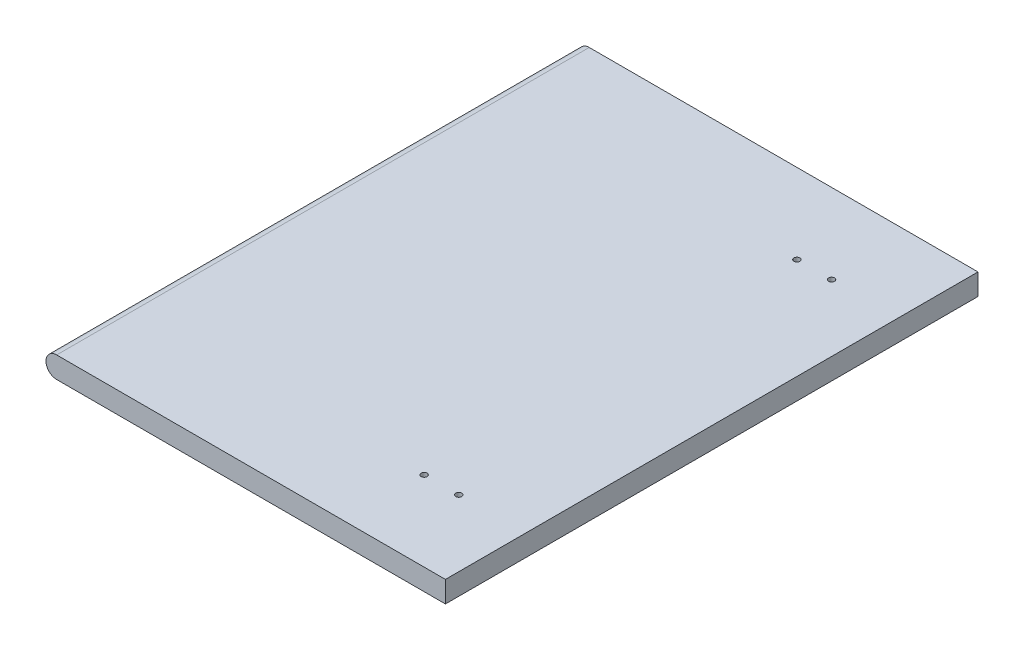
ISO-10303-21;
HEADER;
FILE_DESCRIPTION(('STEP AP214'),'2;1');
FILE_NAME('part.step','',(''),(''),'','','');
FILE_SCHEMA(('AUTOMOTIVE_DESIGN { 1 0 10303 214 1 1 1 1 }'));
ENDSEC;
DATA;
#1=APPLICATION_CONTEXT('core data for automotive mechanical design processes');
#2=APPLICATION_PROTOCOL_DEFINITION('international standard','automotive_design',2000,#1);
#3=PRODUCT_CONTEXT('',#1,'mechanical');
#4=PRODUCT('Part','Part','',(#3));
#5=PRODUCT_RELATED_PRODUCT_CATEGORY('part','',(#4));
#6=PRODUCT_DEFINITION_FORMATION('','',#4);
#7=PRODUCT_DEFINITION_CONTEXT('part definition',#1,'design');
#8=PRODUCT_DEFINITION('design','',#6,#7);
#9=PRODUCT_DEFINITION_SHAPE('','',#8);
#10=(LENGTH_UNIT() NAMED_UNIT(*) SI_UNIT(.MILLI.,.METRE.));
#11=(NAMED_UNIT(*) PLANE_ANGLE_UNIT() SI_UNIT($,.RADIAN.));
#12=(NAMED_UNIT(*) SI_UNIT($,.STERADIAN.) SOLID_ANGLE_UNIT());
#13=UNCERTAINTY_MEASURE_WITH_UNIT(LENGTH_MEASURE(1.E-05),#10,'distance_accuracy_value','');
#14=(GEOMETRIC_REPRESENTATION_CONTEXT(3) GLOBAL_UNCERTAINTY_ASSIGNED_CONTEXT((#13)) GLOBAL_UNIT_ASSIGNED_CONTEXT((#10,
#11,#12)) REPRESENTATION_CONTEXT('',''));
#15=CARTESIAN_POINT('',(0.,0.,0.));
#16=DIRECTION('',(0.,0.,1.));
#17=DIRECTION('',(1.,0.,0.));
#18=AXIS2_PLACEMENT_3D('',#15,#16,#17);
#19=CARTESIAN_POINT('',(150.,16.,200.));
#20=DIRECTION('',(-1.,0.,0.));
#21=DIRECTION('',(0.,0.,1.));
#22=AXIS2_PLACEMENT_3D('',#19,#20,#21);
#23=PLANE('',#22);
#24=DIRECTION('',(0.,0.,-1.));
#25=VECTOR('',#24,1.);
#26=CARTESIAN_POINT('',(150.,0.,200.));
#27=LINE('',#26,#25);
#28=CARTESIAN_POINT('',(150.,0.,200.));
#29=VERTEX_POINT('',#28);
#30=CARTESIAN_POINT('',(150.,0.,-200.));
#31=VERTEX_POINT('',#30);
#32=EDGE_CURVE('E103',#29,#31,#27,.T.);
#33=ORIENTED_EDGE('',*,*,#32,.T.);
#34=DIRECTION('',(0.,-1.,0.));
#35=VECTOR('',#34,1.);
#36=CARTESIAN_POINT('',(150.,16.,-200.));
#37=LINE('',#36,#35);
#38=CARTESIAN_POINT('',(150.,16.,-200.));
#39=VERTEX_POINT('',#38);
#40=EDGE_CURVE('E87',#39,#31,#37,.T.);
#41=ORIENTED_EDGE('',*,*,#40,.F.);
#42=DIRECTION('',(0.,0.,-1.));
#43=VECTOR('',#42,1.);
#44=CARTESIAN_POINT('',(150.,16.,200.));
#45=LINE('',#44,#43);
#46=CARTESIAN_POINT('',(150.,16.,200.));
#47=VERTEX_POINT('',#46);
#48=EDGE_CURVE('E92',#47,#39,#45,.T.);
#49=ORIENTED_EDGE('',*,*,#48,.F.);
#50=DIRECTION('',(0.,-1.,0.));
#51=VECTOR('',#50,1.);
#52=CARTESIAN_POINT('',(150.,16.,200.));
#53=LINE('',#52,#51);
#54=EDGE_CURVE('E105',#47,#29,#53,.T.);
#55=ORIENTED_EDGE('',*,*,#54,.T.);
#56=EDGE_LOOP('',(#33,#41,#49,#55));
#57=FACE_BOUND('',#56,.T.);
#58=ADVANCED_FACE('F41',(#57),#23,.F.);
#59=CARTESIAN_POINT('',(-150.,16.,-200.));
#60=DIRECTION('',(0.,0.,1.));
#61=DIRECTION('',(1.,0.,0.));
#62=AXIS2_PLACEMENT_3D('',#59,#60,#61);
#63=PLANE('',#62);
#64=DIRECTION('',(-1.,0.,0.));
#65=VECTOR('',#64,1.);
#66=CARTESIAN_POINT('',(-150.,0.,-200.));
#67=LINE('',#66,#65);
#68=CARTESIAN_POINT('',(-142.,0.,-200.));
#69=VERTEX_POINT('',#68);
#70=EDGE_CURVE('E140',#31,#69,#67,.T.);
#71=ORIENTED_EDGE('',*,*,#70,.T.);
#72=CARTESIAN_POINT('',(-142.,8.,-200.));
#73=DIRECTION('',(0.,0.,1.));
#74=DIRECTION('',(1.,0.,0.));
#75=AXIS2_PLACEMENT_3D('',#72,#73,#74);
#76=CIRCLE('',#75,8.);
#77=CARTESIAN_POINT('',(-150.,8.,-200.));
#78=VERTEX_POINT('',#77);
#79=EDGE_CURVE('E50',#69,#78,#76,.F.);
#80=ORIENTED_EDGE('',*,*,#79,.T.);
#81=CARTESIAN_POINT('',(-142.,8.,-200.));
#82=DIRECTION('',(0.,0.,1.));
#83=DIRECTION('',(1.,0.,0.));
#84=AXIS2_PLACEMENT_3D('',#81,#82,#83);
#85=CIRCLE('',#84,8.);
#86=CARTESIAN_POINT('',(-142.,16.,-200.));
#87=VERTEX_POINT('',#86);
#88=EDGE_CURVE('E57',#78,#87,#85,.F.);
#89=ORIENTED_EDGE('',*,*,#88,.T.);
#90=DIRECTION('',(-1.,0.,0.));
#91=VECTOR('',#90,1.);
#92=CARTESIAN_POINT('',(-150.,16.,-200.));
#93=LINE('',#92,#91);
#94=EDGE_CURVE('E83',#39,#87,#93,.T.);
#95=ORIENTED_EDGE('',*,*,#94,.F.);
#96=ORIENTED_EDGE('',*,*,#40,.T.);
#97=EDGE_LOOP('',(#71,#80,#89,#95,#96));
#98=FACE_BOUND('',#97,.T.);
#99=ADVANCED_FACE('F85',(#98),#63,.F.);
#100=CARTESIAN_POINT('',(-150.,16.,200.));
#101=DIRECTION('',(0.,0.,-1.));
#102=DIRECTION('',(-1.,0.,0.));
#103=AXIS2_PLACEMENT_3D('',#100,#101,#102);
#104=PLANE('',#103);
#105=CARTESIAN_POINT('',(-142.,8.,200.));
#106=DIRECTION('',(0.,0.,-1.));
#107=DIRECTION('',(-1.,0.,0.));
#108=AXIS2_PLACEMENT_3D('',#105,#106,#107);
#109=CIRCLE('',#108,8.);
#110=CARTESIAN_POINT('',(-142.,16.,200.));
#111=VERTEX_POINT('',#110);
#112=CARTESIAN_POINT('',(-150.,8.,200.));
#113=VERTEX_POINT('',#112);
#114=EDGE_CURVE('E104',#111,#113,#109,.F.);
#115=ORIENTED_EDGE('',*,*,#114,.T.);
#116=CARTESIAN_POINT('',(-142.,8.,200.));
#117=DIRECTION('',(0.,0.,-1.));
#118=DIRECTION('',(-1.,0.,0.));
#119=AXIS2_PLACEMENT_3D('',#116,#117,#118);
#120=CIRCLE('',#119,8.);
#121=CARTESIAN_POINT('',(-142.,0.,200.));
#122=VERTEX_POINT('',#121);
#123=EDGE_CURVE('E107',#113,#122,#120,.F.);
#124=ORIENTED_EDGE('',*,*,#123,.T.);
#125=DIRECTION('',(1.,0.,0.));
#126=VECTOR('',#125,1.);
#127=CARTESIAN_POINT('',(-150.,0.,200.));
#128=LINE('',#127,#126);
#129=EDGE_CURVE('E100',#122,#29,#128,.T.);
#130=ORIENTED_EDGE('',*,*,#129,.T.);
#131=ORIENTED_EDGE('',*,*,#54,.F.);
#132=DIRECTION('',(1.,0.,0.));
#133=VECTOR('',#132,1.);
#134=CARTESIAN_POINT('',(-150.,16.,200.));
#135=LINE('',#134,#133);
#136=EDGE_CURVE('E91',#111,#47,#135,.T.);
#137=ORIENTED_EDGE('',*,*,#136,.F.);
#138=EDGE_LOOP('',(#115,#124,#130,#131,#137));
#139=FACE_BOUND('',#138,.T.);
#140=ADVANCED_FACE('F171',(#139),#104,.F.);
#141=CARTESIAN_POINT('',(0.,16.,0.));
#142=DIRECTION('',(0.,-1.,0.));
#143=DIRECTION('',(0.,0.,-1.));
#144=AXIS2_PLACEMENT_3D('',#141,#142,#143);
#145=PLANE('',#144);
#146=CARTESIAN_POINT('',(99.9999999999999,16.,-140.));
#147=DIRECTION('',(0.,-1.,0.));
#148=DIRECTION('',(0.,0.,-1.));
#149=AXIS2_PLACEMENT_3D('',#146,#147,#148);
#150=CIRCLE('',#149,2.24789999999998);
#151=CARTESIAN_POINT('',(99.9999999999999,16.,-142.2479));
#152=VERTEX_POINT('',#151);
#153=EDGE_CURVE('E126',#152,#152,#150,.T.);
#154=ORIENTED_EDGE('',*,*,#153,.T.);
#155=EDGE_LOOP('',(#154));
#156=FACE_BOUND('',#155,.T.);
#157=CARTESIAN_POINT('',(74.,16.,-140.));
#158=DIRECTION('',(0.,-1.,0.));
#159=DIRECTION('',(0.,0.,-1.));
#160=AXIS2_PLACEMENT_3D('',#157,#158,#159);
#161=CIRCLE('',#160,2.24789999999998);
#162=CARTESIAN_POINT('',(74.,16.,-142.2479));
#163=VERTEX_POINT('',#162);
#164=EDGE_CURVE('E121',#163,#163,#161,.T.);
#165=ORIENTED_EDGE('',*,*,#164,.T.);
#166=EDGE_LOOP('',(#165));
#167=FACE_BOUND('',#166,.T.);
#168=CARTESIAN_POINT('',(99.9999999999999,16.,140.));
#169=DIRECTION('',(0.,-1.,0.));
#170=DIRECTION('',(0.,0.,-1.));
#171=AXIS2_PLACEMENT_3D('',#168,#169,#170);
#172=CIRCLE('',#171,2.24789999999998);
#173=CARTESIAN_POINT('',(99.9999999999999,16.,137.7521));
#174=VERTEX_POINT('',#173);
#175=EDGE_CURVE('E116',#174,#174,#172,.T.);
#176=ORIENTED_EDGE('',*,*,#175,.T.);
#177=EDGE_LOOP('',(#176));
#178=FACE_BOUND('',#177,.T.);
#179=CARTESIAN_POINT('',(74.,16.,140.));
#180=DIRECTION('',(0.,-1.,0.));
#181=DIRECTION('',(0.,0.,-1.));
#182=AXIS2_PLACEMENT_3D('',#179,#180,#181);
#183=CIRCLE('',#182,2.24789999999998);
#184=CARTESIAN_POINT('',(74.,16.,137.7521));
#185=VERTEX_POINT('',#184);
#186=EDGE_CURVE('E112',#185,#185,#183,.T.);
#187=ORIENTED_EDGE('',*,*,#186,.T.);
#188=EDGE_LOOP('',(#187));
#189=FACE_BOUND('',#188,.T.);
#190=ORIENTED_EDGE('',*,*,#94,.T.);
#191=DIRECTION('',(0.,0.,1.));
#192=VECTOR('',#191,1.);
#193=CARTESIAN_POINT('',(-142.,16.,0.));
#194=LINE('',#193,#192);
#195=EDGE_CURVE('E11',#87,#111,#194,.T.);
#196=ORIENTED_EDGE('',*,*,#195,.T.);
#197=ORIENTED_EDGE('',*,*,#136,.T.);
#198=ORIENTED_EDGE('',*,*,#48,.T.);
#199=EDGE_LOOP('',(#190,#196,#197,#198));
#200=FACE_BOUND('',#199,.T.);
#201=ADVANCED_FACE('F95',(#156,#167,#178,#189,#200),#145,.F.);
#202=CARTESIAN_POINT('',(0.,0.,0.));
#203=DIRECTION('',(0.,-1.,0.));
#204=DIRECTION('',(0.,0.,-1.));
#205=AXIS2_PLACEMENT_3D('',#202,#203,#204);
#206=PLANE('',#205);
#207=CARTESIAN_POINT('',(99.9999999999999,0.,-140.));
#208=DIRECTION('',(0.,-1.,0.));
#209=DIRECTION('',(0.,0.,-1.));
#210=AXIS2_PLACEMENT_3D('',#207,#208,#209);
#211=CIRCLE('',#210,4.21639999999999);
#212=CARTESIAN_POINT('',(99.9999999999999,0.,-144.2164));
#213=VERTEX_POINT('',#212);
#214=EDGE_CURVE('E161',#213,#213,#211,.T.);
#215=ORIENTED_EDGE('',*,*,#214,.F.);
#216=EDGE_LOOP('',(#215));
#217=FACE_BOUND('',#216,.T.);
#218=CARTESIAN_POINT('',(74.,0.,-140.));
#219=DIRECTION('',(0.,-1.,0.));
#220=DIRECTION('',(0.,0.,-1.));
#221=AXIS2_PLACEMENT_3D('',#218,#219,#220);
#222=CIRCLE('',#221,4.21639999999999);
#223=CARTESIAN_POINT('',(74.,0.,-144.2164));
#224=VERTEX_POINT('',#223);
#225=EDGE_CURVE('E128',#224,#224,#222,.T.);
#226=ORIENTED_EDGE('',*,*,#225,.F.);
#227=EDGE_LOOP('',(#226));
#228=FACE_BOUND('',#227,.T.);
#229=CARTESIAN_POINT('',(99.9999999999999,0.,140.));
#230=DIRECTION('',(0.,-1.,0.));
#231=DIRECTION('',(0.,0.,-1.));
#232=AXIS2_PLACEMENT_3D('',#229,#230,#231);
#233=CIRCLE('',#232,4.21639999999999);
#234=CARTESIAN_POINT('',(99.9999999999999,0.,135.7836));
#235=VERTEX_POINT('',#234);
#236=EDGE_CURVE('E124',#235,#235,#233,.T.);
#237=ORIENTED_EDGE('',*,*,#236,.F.);
#238=EDGE_LOOP('',(#237));
#239=FACE_BOUND('',#238,.T.);
#240=CARTESIAN_POINT('',(74.,0.,140.));
#241=DIRECTION('',(0.,-1.,0.));
#242=DIRECTION('',(0.,0.,-1.));
#243=AXIS2_PLACEMENT_3D('',#240,#241,#242);
#244=CIRCLE('',#243,4.21639999999999);
#245=CARTESIAN_POINT('',(74.,0.,135.7836));
#246=VERTEX_POINT('',#245);
#247=EDGE_CURVE('E119',#246,#246,#244,.T.);
#248=ORIENTED_EDGE('',*,*,#247,.F.);
#249=EDGE_LOOP('',(#248));
#250=FACE_BOUND('',#249,.T.);
#251=ORIENTED_EDGE('',*,*,#129,.F.);
#252=DIRECTION('',(0.,0.,1.));
#253=VECTOR('',#252,1.);
#254=CARTESIAN_POINT('',(-142.,0.,-200.));
#255=LINE('',#254,#253);
#256=EDGE_CURVE('E132',#122,#69,#255,.F.);
#257=ORIENTED_EDGE('',*,*,#256,.T.);
#258=ORIENTED_EDGE('',*,*,#70,.F.);
#259=ORIENTED_EDGE('',*,*,#32,.F.);
#260=EDGE_LOOP('',(#251,#257,#258,#259));
#261=FACE_BOUND('',#260,.T.);
#262=ADVANCED_FACE('F139',(#217,#228,#239,#250,#261),#206,.T.);
#263=CARTESIAN_POINT('',(74.,0.,140.));
#264=DIRECTION('',(0.,-1.,0.));
#265=DIRECTION('',(0.,0.,-1.));
#266=AXIS2_PLACEMENT_3D('',#263,#264,#265);
#267=CYLINDRICAL_SURFACE('',#266,2.24789999999998);
#268=CARTESIAN_POINT('',(74.,1.65176762397247,140.));
#269=DIRECTION('',(0.,-1.,0.));
#270=DIRECTION('',(0.,0.,-1.));
#271=AXIS2_PLACEMENT_3D('',#268,#269,#270);
#272=CIRCLE('',#271,2.24789999999998);
#273=CARTESIAN_POINT('',(74.,1.65176762397247,137.7521));
#274=VERTEX_POINT('',#273);
#275=EDGE_CURVE('E115',#274,#274,#272,.T.);
#276=ORIENTED_EDGE('',*,*,#275,.T.);
#277=EDGE_LOOP('',(#276));
#278=FACE_BOUND('',#277,.T.);
#279=ORIENTED_EDGE('',*,*,#186,.F.);
#280=EDGE_LOOP('',(#279));
#281=FACE_BOUND('',#280,.T.);
#282=ADVANCED_FACE('F225',(#278,#281),#267,.F.);
#283=CARTESIAN_POINT('',(74.,0.,140.));
#284=DIRECTION('',(0.,-1.,0.));
#285=DIRECTION('',(0.,0.,-1.));
#286=AXIS2_PLACEMENT_3D('',#283,#284,#285);
#287=CONICAL_SURFACE('',#286,4.21639999999999,0.872664625997169);
#288=ORIENTED_EDGE('',*,*,#275,.F.);
#289=EDGE_LOOP('',(#288));
#290=FACE_BOUND('',#289,.T.);
#291=ORIENTED_EDGE('',*,*,#247,.T.);
#292=EDGE_LOOP('',(#291));
#293=FACE_BOUND('',#292,.T.);
#294=ADVANCED_FACE('F221',(#290,#293),#287,.F.);
#295=CARTESIAN_POINT('',(99.9999999999999,0.,140.));
#296=DIRECTION('',(0.,-1.,0.));
#297=DIRECTION('',(0.,0.,-1.));
#298=AXIS2_PLACEMENT_3D('',#295,#296,#297);
#299=CYLINDRICAL_SURFACE('',#298,2.24789999999998);
#300=CARTESIAN_POINT('',(99.9999999999999,1.65176762397247,140.));
#301=DIRECTION('',(0.,-1.,0.));
#302=DIRECTION('',(0.,0.,-1.));
#303=AXIS2_PLACEMENT_3D('',#300,#301,#302);
#304=CIRCLE('',#303,2.24789999999998);
#305=CARTESIAN_POINT('',(99.9999999999999,1.65176762397247,137.7521));
#306=VERTEX_POINT('',#305);
#307=EDGE_CURVE('E120',#306,#306,#304,.T.);
#308=ORIENTED_EDGE('',*,*,#307,.T.);
#309=EDGE_LOOP('',(#308));
#310=FACE_BOUND('',#309,.T.);
#311=ORIENTED_EDGE('',*,*,#175,.F.);
#312=EDGE_LOOP('',(#311));
#313=FACE_BOUND('',#312,.T.);
#314=ADVANCED_FACE('F217',(#310,#313),#299,.F.);
#315=CARTESIAN_POINT('',(99.9999999999999,0.,140.));
#316=DIRECTION('',(0.,-1.,0.));
#317=DIRECTION('',(0.,0.,-1.));
#318=AXIS2_PLACEMENT_3D('',#315,#316,#317);
#319=CONICAL_SURFACE('',#318,4.21639999999999,0.872664625997169);
#320=ORIENTED_EDGE('',*,*,#307,.F.);
#321=EDGE_LOOP('',(#320));
#322=FACE_BOUND('',#321,.T.);
#323=ORIENTED_EDGE('',*,*,#236,.T.);
#324=EDGE_LOOP('',(#323));
#325=FACE_BOUND('',#324,.T.);
#326=ADVANCED_FACE('F213',(#322,#325),#319,.F.);
#327=CARTESIAN_POINT('',(74.,0.,-140.));
#328=DIRECTION('',(0.,-1.,0.));
#329=DIRECTION('',(0.,0.,-1.));
#330=AXIS2_PLACEMENT_3D('',#327,#328,#329);
#331=CYLINDRICAL_SURFACE('',#330,2.24789999999998);
#332=CARTESIAN_POINT('',(74.,1.65176762397247,-140.));
#333=DIRECTION('',(0.,-1.,0.));
#334=DIRECTION('',(0.,0.,-1.));
#335=AXIS2_PLACEMENT_3D('',#332,#333,#334);
#336=CIRCLE('',#335,2.24789999999998);
#337=CARTESIAN_POINT('',(74.,1.65176762397247,-142.2479));
#338=VERTEX_POINT('',#337);
#339=EDGE_CURVE('E125',#338,#338,#336,.T.);
#340=ORIENTED_EDGE('',*,*,#339,.T.);
#341=EDGE_LOOP('',(#340));
#342=FACE_BOUND('',#341,.T.);
#343=ORIENTED_EDGE('',*,*,#164,.F.);
#344=EDGE_LOOP('',(#343));
#345=FACE_BOUND('',#344,.T.);
#346=ADVANCED_FACE('F209',(#342,#345),#331,.F.);
#347=CARTESIAN_POINT('',(74.,0.,-140.));
#348=DIRECTION('',(0.,-1.,0.));
#349=DIRECTION('',(0.,0.,-1.));
#350=AXIS2_PLACEMENT_3D('',#347,#348,#349);
#351=CONICAL_SURFACE('',#350,4.21639999999999,0.872664625997169);
#352=ORIENTED_EDGE('',*,*,#339,.F.);
#353=EDGE_LOOP('',(#352));
#354=FACE_BOUND('',#353,.T.);
#355=ORIENTED_EDGE('',*,*,#225,.T.);
#356=EDGE_LOOP('',(#355));
#357=FACE_BOUND('',#356,.T.);
#358=ADVANCED_FACE('F202',(#354,#357),#351,.F.);
#359=CARTESIAN_POINT('',(99.9999999999999,0.,-140.));
#360=DIRECTION('',(0.,-1.,0.));
#361=DIRECTION('',(0.,0.,-1.));
#362=AXIS2_PLACEMENT_3D('',#359,#360,#361);
#363=CYLINDRICAL_SURFACE('',#362,2.24789999999998);
#364=CARTESIAN_POINT('',(99.9999999999999,1.65176762397247,-140.));
#365=DIRECTION('',(0.,-1.,0.));
#366=DIRECTION('',(0.,0.,-1.));
#367=AXIS2_PLACEMENT_3D('',#364,#365,#366);
#368=CIRCLE('',#367,2.24789999999998);
#369=CARTESIAN_POINT('',(99.9999999999999,1.65176762397247,-142.2479));
#370=VERTEX_POINT('',#369);
#371=EDGE_CURVE('E129',#370,#370,#368,.T.);
#372=ORIENTED_EDGE('',*,*,#371,.T.);
#373=EDGE_LOOP('',(#372));
#374=FACE_BOUND('',#373,.T.);
#375=ORIENTED_EDGE('',*,*,#153,.F.);
#376=EDGE_LOOP('',(#375));
#377=FACE_BOUND('',#376,.T.);
#378=ADVANCED_FACE('F196',(#374,#377),#363,.F.);
#379=CARTESIAN_POINT('',(99.9999999999999,0.,-140.));
#380=DIRECTION('',(0.,-1.,0.));
#381=DIRECTION('',(0.,0.,-1.));
#382=AXIS2_PLACEMENT_3D('',#379,#380,#381);
#383=CONICAL_SURFACE('',#382,4.21639999999999,0.872664625997169);
#384=ORIENTED_EDGE('',*,*,#371,.F.);
#385=EDGE_LOOP('',(#384));
#386=FACE_BOUND('',#385,.T.);
#387=ORIENTED_EDGE('',*,*,#214,.T.);
#388=EDGE_LOOP('',(#387));
#389=FACE_BOUND('',#388,.T.);
#390=ADVANCED_FACE('F191',(#386,#389),#383,.F.);
#391=CARTESIAN_POINT('',(-142.,8.,0.));
#392=DIRECTION('',(0.,0.,1.));
#393=DIRECTION('',(1.,0.,0.));
#394=AXIS2_PLACEMENT_3D('',#391,#392,#393);
#395=CYLINDRICAL_SURFACE('',#394,8.);
#396=ORIENTED_EDGE('',*,*,#195,.F.);
#397=ORIENTED_EDGE('',*,*,#88,.F.);
#398=DIRECTION('',(0.,0.,1.));
#399=VECTOR('',#398,1.);
#400=CARTESIAN_POINT('',(-150.,8.,200.));
#401=LINE('',#400,#399);
#402=EDGE_CURVE('E45',#113,#78,#401,.F.);
#403=ORIENTED_EDGE('',*,*,#402,.F.);
#404=ORIENTED_EDGE('',*,*,#114,.F.);
#405=EDGE_LOOP('',(#396,#397,#403,#404));
#406=FACE_BOUND('',#405,.T.);
#407=ADVANCED_FACE('F43',(#406),#395,.T.);
#408=CARTESIAN_POINT('',(-142.,8.,200.));
#409=DIRECTION('',(0.,0.,-1.));
#410=DIRECTION('',(-1.,0.,0.));
#411=AXIS2_PLACEMENT_3D('',#408,#409,#410);
#412=CYLINDRICAL_SURFACE('',#411,8.);
#413=ORIENTED_EDGE('',*,*,#79,.F.);
#414=ORIENTED_EDGE('',*,*,#256,.F.);
#415=ORIENTED_EDGE('',*,*,#123,.F.);
#416=ORIENTED_EDGE('',*,*,#402,.T.);
#417=EDGE_LOOP('',(#413,#414,#415,#416));
#418=FACE_BOUND('',#417,.T.);
#419=ADVANCED_FACE('F167',(#418),#412,.T.);
#420=CLOSED_SHELL('',(#58,#99,#140,#201,#262,#282,#294,#314,#326,#346,#358,#378,#390,#407,#419));
#421=MANIFOLD_SOLID_BREP('B2',#420);
#422=ADVANCED_BREP_SHAPE_REPRESENTATION('',(#18,#421),#14);
#423=SHAPE_DEFINITION_REPRESENTATION(#9,#422);
ENDSEC;
END-ISO-10303-21;
